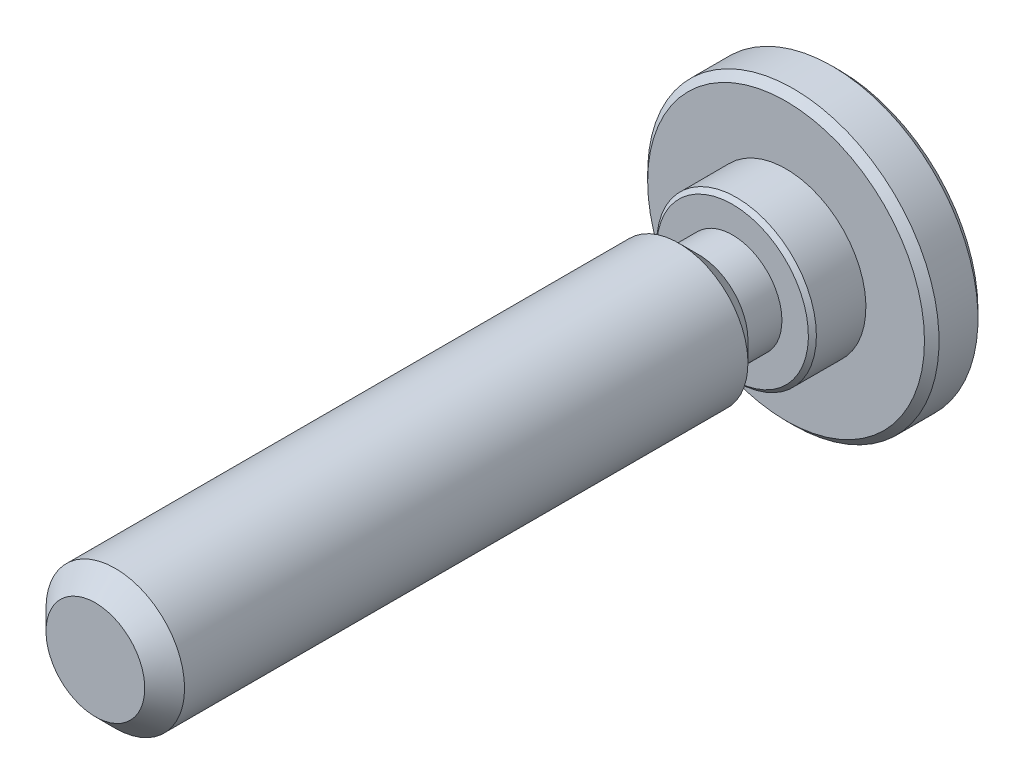
ISO-10303-21;
HEADER;
FILE_DESCRIPTION(('STEP AP214'),'2;1');
FILE_NAME('part.step','',(''),(''),'','','');
FILE_SCHEMA(('AUTOMOTIVE_DESIGN { 1 0 10303 214 1 1 1 1 }'));
ENDSEC;
DATA;
#1=APPLICATION_CONTEXT('core data for automotive mechanical design processes');
#2=APPLICATION_PROTOCOL_DEFINITION('international standard','automotive_design',2000,#1);
#3=PRODUCT_CONTEXT('',#1,'mechanical');
#4=PRODUCT('Part','Part','',(#3));
#5=PRODUCT_RELATED_PRODUCT_CATEGORY('part','',(#4));
#6=PRODUCT_DEFINITION_FORMATION('','',#4);
#7=PRODUCT_DEFINITION_CONTEXT('part definition',#1,'design');
#8=PRODUCT_DEFINITION('design','',#6,#7);
#9=PRODUCT_DEFINITION_SHAPE('','',#8);
#10=(LENGTH_UNIT() NAMED_UNIT(*) SI_UNIT(.MILLI.,.METRE.));
#11=(NAMED_UNIT(*) PLANE_ANGLE_UNIT() SI_UNIT($,.RADIAN.));
#12=(NAMED_UNIT(*) SI_UNIT($,.STERADIAN.) SOLID_ANGLE_UNIT());
#13=UNCERTAINTY_MEASURE_WITH_UNIT(LENGTH_MEASURE(1.E-05),#10,'distance_accuracy_value','');
#14=(GEOMETRIC_REPRESENTATION_CONTEXT(3) GLOBAL_UNCERTAINTY_ASSIGNED_CONTEXT((#13)) GLOBAL_UNIT_ASSIGNED_CONTEXT((#10,
#11,#12)) REPRESENTATION_CONTEXT('',''));
#15=CARTESIAN_POINT('',(0.,0.,0.));
#16=DIRECTION('',(0.,0.,1.));
#17=DIRECTION('',(1.,0.,0.));
#18=AXIS2_PLACEMENT_3D('',#15,#16,#17);
#19=CARTESIAN_POINT('',(0.,0.,-1.6002));
#20=DIRECTION('',(0.,0.,1.));
#21=DIRECTION('',(0.,-1.,0.));
#22=AXIS2_PLACEMENT_3D('',#19,#20,#21);
#23=PLANE('',#22);
#24=CARTESIAN_POINT('',(0.,0.,-1.6002));
#25=DIRECTION('',(0.,0.,1.));
#26=DIRECTION('',(0.,-1.,0.));
#27=AXIS2_PLACEMENT_3D('',#24,#25,#26);
#28=CIRCLE('',#27,4.13829499999999);
#29=CARTESIAN_POINT('',(0.,-4.13829499999999,-1.6002));
#30=VERTEX_POINT('',#29);
#31=EDGE_CURVE('E217',#30,#30,#28,.F.);
#32=ORIENTED_EDGE('',*,*,#31,.T.);
#33=EDGE_LOOP('',(#32));
#34=FACE_BOUND('',#33,.T.);
#35=CARTESIAN_POINT('',(0.,0.,-1.6002));
#36=DIRECTION('',(0.,0.,-1.));
#37=DIRECTION('',(0.,1.,0.));
#38=AXIS2_PLACEMENT_3D('',#35,#36,#37);
#39=CIRCLE('',#38,1.14567944042316);
#40=CARTESIAN_POINT('',(0.,-1.14567944042316,-1.6002));
#41=VERTEX_POINT('',#40);
#42=CARTESIAN_POINT('',(-0.9921875,-0.572839720211582,-1.6002));
#43=VERTEX_POINT('',#42);
#44=EDGE_CURVE('E56',#41,#43,#39,.T.);
#45=ORIENTED_EDGE('',*,*,#44,.F.);
#46=CARTESIAN_POINT('',(0.9921875,-0.572839720211581,-1.6002));
#47=VERTEX_POINT('',#46);
#48=EDGE_CURVE('E132',#47,#41,#39,.T.);
#49=ORIENTED_EDGE('',*,*,#48,.F.);
#50=CARTESIAN_POINT('',(0.9921875,0.572839720211582,-1.6002));
#51=VERTEX_POINT('',#50);
#52=EDGE_CURVE('E127',#51,#47,#39,.T.);
#53=ORIENTED_EDGE('',*,*,#52,.F.);
#54=CARTESIAN_POINT('',(0.,1.14567944042316,-1.6002));
#55=VERTEX_POINT('',#54);
#56=EDGE_CURVE('E97',#55,#51,#39,.T.);
#57=ORIENTED_EDGE('',*,*,#56,.F.);
#58=CARTESIAN_POINT('',(-0.9921875,0.572839720211582,-1.6002));
#59=VERTEX_POINT('',#58);
#60=EDGE_CURVE('E88',#59,#55,#39,.T.);
#61=ORIENTED_EDGE('',*,*,#60,.F.);
#62=EDGE_CURVE('E49',#43,#59,#39,.T.);
#63=ORIENTED_EDGE('',*,*,#62,.F.);
#64=EDGE_LOOP('',(#45,#49,#53,#57,#61,#63));
#65=FACE_BOUND('',#64,.T.);
#66=ADVANCED_FACE('F35',(#34,#65),#23,.F.);
#67=CARTESIAN_POINT('',(0.,0.,20.6502));
#68=DIRECTION('',(0.,0.,1.));
#69=DIRECTION('',(0.,-1.,0.));
#70=AXIS2_PLACEMENT_3D('',#67,#68,#69);
#71=CYLINDRICAL_SURFACE('',#70,4.3561);
#72=CARTESIAN_POINT('',(0.,0.,-1.38239499999999));
#73=DIRECTION('',(0.,0.,1.));
#74=DIRECTION('',(0.,-1.,0.));
#75=AXIS2_PLACEMENT_3D('',#72,#73,#74);
#76=CIRCLE('',#75,4.3561);
#77=CARTESIAN_POINT('',(0.,-4.3561,-1.38239499999999));
#78=VERTEX_POINT('',#77);
#79=EDGE_CURVE('E218',#78,#78,#76,.T.);
#80=ORIENTED_EDGE('',*,*,#79,.T.);
#81=EDGE_LOOP('',(#80));
#82=FACE_BOUND('',#81,.T.);
#83=CARTESIAN_POINT('',(0.,0.,-0.217804999999991));
#84=DIRECTION('',(0.,0.,-1.));
#85=DIRECTION('',(0.,1.,0.));
#86=AXIS2_PLACEMENT_3D('',#83,#84,#85);
#87=CIRCLE('',#86,4.3561);
#88=CARTESIAN_POINT('',(0.,4.3561,-0.217804999999991));
#89=VERTEX_POINT('',#88);
#90=EDGE_CURVE('E213',#89,#89,#87,.T.);
#91=ORIENTED_EDGE('',*,*,#90,.T.);
#92=EDGE_LOOP('',(#91));
#93=FACE_BOUND('',#92,.T.);
#94=ADVANCED_FACE('F183',(#82,#93),#71,.T.);
#95=CARTESIAN_POINT('',(0.,4.3561,0.));
#96=DIRECTION('',(0.,0.,-1.));
#97=DIRECTION('',(0.,1.,0.));
#98=AXIS2_PLACEMENT_3D('',#95,#96,#97);
#99=PLANE('',#98);
#100=CARTESIAN_POINT('',(0.,0.,0.));
#101=DIRECTION('',(0.,0.,-1.));
#102=DIRECTION('',(0.,1.,0.));
#103=AXIS2_PLACEMENT_3D('',#100,#101,#102);
#104=CIRCLE('',#103,4.13829500000001);
#105=CARTESIAN_POINT('',(0.,4.13829500000001,0.));
#106=VERTEX_POINT('',#105);
#107=EDGE_CURVE('E106',#106,#106,#104,.F.);
#108=ORIENTED_EDGE('',*,*,#107,.T.);
#109=EDGE_LOOP('',(#108));
#110=FACE_BOUND('',#109,.T.);
#111=CARTESIAN_POINT('',(0.,0.,0.));
#112=DIRECTION('',(0.,0.,1.));
#113=DIRECTION('',(0.,-1.,0.));
#114=AXIS2_PLACEMENT_3D('',#111,#112,#113);
#115=CIRCLE('',#114,2.3876);
#116=CARTESIAN_POINT('',(0.,-2.3876,0.));
#117=VERTEX_POINT('',#116);
#118=EDGE_CURVE('E230',#117,#117,#115,.T.);
#119=ORIENTED_EDGE('',*,*,#118,.F.);
#120=EDGE_LOOP('',(#119));
#121=FACE_BOUND('',#120,.T.);
#122=ADVANCED_FACE('F191',(#110,#121),#99,.F.);
#123=CARTESIAN_POINT('',(0.,0.,20.6502));
#124=DIRECTION('',(0.,0.,1.));
#125=DIRECTION('',(0.,-1.,0.));
#126=AXIS2_PLACEMENT_3D('',#123,#124,#125);
#127=CYLINDRICAL_SURFACE('',#126,2.3876);
#128=CARTESIAN_POINT('',(0.,0.,1.48082));
#129=DIRECTION('',(0.,0.,-1.));
#130=DIRECTION('',(0.,1.,0.));
#131=AXIS2_PLACEMENT_3D('',#128,#129,#130);
#132=CIRCLE('',#131,2.3876);
#133=CARTESIAN_POINT('',(0.,2.3876,1.48082));
#134=VERTEX_POINT('',#133);
#135=EDGE_CURVE('E11',#134,#134,#132,.T.);
#136=ORIENTED_EDGE('',*,*,#135,.T.);
#137=EDGE_LOOP('',(#136));
#138=FACE_BOUND('',#137,.T.);
#139=ORIENTED_EDGE('',*,*,#118,.T.);
#140=EDGE_LOOP('',(#139));
#141=FACE_BOUND('',#140,.T.);
#142=ADVANCED_FACE('F334',(#138,#141),#127,.T.);
#143=CARTESIAN_POINT('',(0.,2.3876,1.6002));
#144=DIRECTION('',(0.,0.,-1.));
#145=DIRECTION('',(0.,1.,0.));
#146=AXIS2_PLACEMENT_3D('',#143,#144,#145);
#147=PLANE('',#146);
#148=CARTESIAN_POINT('',(0.,0.,1.6002));
#149=DIRECTION('',(0.,0.,-1.));
#150=DIRECTION('',(0.,1.,0.));
#151=AXIS2_PLACEMENT_3D('',#148,#149,#150);
#152=CIRCLE('',#151,2.26822000000001);
#153=CARTESIAN_POINT('',(0.,2.26822000000001,1.6002));
#154=VERTEX_POINT('',#153);
#155=EDGE_CURVE('E43',#154,#154,#152,.F.);
#156=ORIENTED_EDGE('',*,*,#155,.T.);
#157=EDGE_LOOP('',(#156));
#158=FACE_BOUND('',#157,.T.);
#159=CARTESIAN_POINT('',(0.,0.,1.6002));
#160=DIRECTION('',(0.,0.,1.));
#161=DIRECTION('',(0.,-1.,0.));
#162=AXIS2_PLACEMENT_3D('',#159,#160,#161);
#163=CIRCLE('',#162,1.4760575);
#164=CARTESIAN_POINT('',(0.,-1.4760575,1.6002));
#165=VERTEX_POINT('',#164);
#166=EDGE_CURVE('E233',#165,#165,#163,.T.);
#167=ORIENTED_EDGE('',*,*,#166,.F.);
#168=EDGE_LOOP('',(#167));
#169=FACE_BOUND('',#168,.T.);
#170=ADVANCED_FACE('F171',(#158,#169),#147,.F.);
#171=CARTESIAN_POINT('',(0.,0.,20.6502));
#172=DIRECTION('',(0.,0.,1.));
#173=DIRECTION('',(0.,-1.,0.));
#174=AXIS2_PLACEMENT_3D('',#171,#172,#173);
#175=CYLINDRICAL_SURFACE('',#174,1.4760575);
#176=CARTESIAN_POINT('',(0.,0.,2.6162));
#177=DIRECTION('',(0.,0.,1.));
#178=DIRECTION('',(0.,-1.,0.));
#179=AXIS2_PLACEMENT_3D('',#176,#177,#178);
#180=CIRCLE('',#179,1.4760575);
#181=CARTESIAN_POINT('',(0.,-1.4760575,2.6162));
#182=VERTEX_POINT('',#181);
#183=EDGE_CURVE('E236',#182,#182,#180,.T.);
#184=ORIENTED_EDGE('',*,*,#183,.F.);
#185=EDGE_LOOP('',(#184));
#186=FACE_BOUND('',#185,.T.);
#187=ORIENTED_EDGE('',*,*,#166,.T.);
#188=EDGE_LOOP('',(#187));
#189=FACE_BOUND('',#188,.T.);
#190=ADVANCED_FACE('F371',(#186,#189),#175,.T.);
#191=CARTESIAN_POINT('',(0.,0.,2.6162));
#192=DIRECTION('',(0.,0.,1.));
#193=DIRECTION('',(0.,-1.,0.));
#194=AXIS2_PLACEMENT_3D('',#191,#192,#193);
#195=CONICAL_SURFACE('',#194,1.4760575,0.785398163397447);
#196=CARTESIAN_POINT('',(0.,0.,3.2115125));
#197=DIRECTION('',(0.,0.,1.));
#198=DIRECTION('',(0.,-1.,0.));
#199=AXIS2_PLACEMENT_3D('',#196,#197,#198);
#200=CIRCLE('',#199,2.07137);
#201=CARTESIAN_POINT('',(0.,-2.07137,3.2115125));
#202=VERTEX_POINT('',#201);
#203=EDGE_CURVE('E239',#202,#202,#200,.T.);
#204=ORIENTED_EDGE('',*,*,#203,.F.);
#205=EDGE_LOOP('',(#204));
#206=FACE_BOUND('',#205,.T.);
#207=ORIENTED_EDGE('',*,*,#183,.T.);
#208=EDGE_LOOP('',(#207));
#209=FACE_BOUND('',#208,.T.);
#210=ADVANCED_FACE('F378',(#206,#209),#195,.T.);
#211=CARTESIAN_POINT('',(0.,0.,20.6502));
#212=DIRECTION('',(0.,0.,1.));
#213=DIRECTION('',(0.,-1.,0.));
#214=AXIS2_PLACEMENT_3D('',#211,#212,#213);
#215=CYLINDRICAL_SURFACE('',#214,2.07137);
#216=CARTESIAN_POINT('',(0.,0.,20.0548875));
#217=DIRECTION('',(0.,0.,-1.));
#218=DIRECTION('',(0.,1.,0.));
#219=AXIS2_PLACEMENT_3D('',#216,#217,#218);
#220=CIRCLE('',#219,2.07137);
#221=CARTESIAN_POINT('',(0.,2.07137,20.0548875));
#222=VERTEX_POINT('',#221);
#223=EDGE_CURVE('E224',#222,#222,#220,.T.);
#224=ORIENTED_EDGE('',*,*,#223,.T.);
#225=EDGE_LOOP('',(#224));
#226=FACE_BOUND('',#225,.T.);
#227=ORIENTED_EDGE('',*,*,#203,.T.);
#228=EDGE_LOOP('',(#227));
#229=FACE_BOUND('',#228,.T.);
#230=ADVANCED_FACE('F386',(#226,#229),#215,.T.);
#231=CARTESIAN_POINT('',(0.,2.07137,20.6502));
#232=DIRECTION('',(0.,0.,-1.));
#233=DIRECTION('',(0.,1.,0.));
#234=AXIS2_PLACEMENT_3D('',#231,#232,#233);
#235=PLANE('',#234);
#236=CARTESIAN_POINT('',(0.,0.,20.6502));
#237=DIRECTION('',(0.,0.,-1.));
#238=DIRECTION('',(0.,1.,0.));
#239=AXIS2_PLACEMENT_3D('',#236,#237,#238);
#240=CIRCLE('',#239,1.4760575);
#241=CARTESIAN_POINT('',(0.,1.47605749999999,20.6502));
#242=VERTEX_POINT('',#241);
#243=EDGE_CURVE('E227',#242,#242,#240,.F.);
#244=ORIENTED_EDGE('',*,*,#243,.T.);
#245=EDGE_LOOP('',(#244));
#246=FACE_BOUND('',#245,.T.);
#247=ADVANCED_FACE('F201',(#246),#235,.F.);
#248=CARTESIAN_POINT('',(0.,0.,20.6502));
#249=DIRECTION('',(0.,0.,-1.));
#250=DIRECTION('',(0.,1.,0.));
#251=AXIS2_PLACEMENT_3D('',#248,#249,#250);
#252=CONICAL_SURFACE('',#251,1.4760575,0.785398163397448);
#253=ORIENTED_EDGE('',*,*,#223,.F.);
#254=EDGE_LOOP('',(#253));
#255=FACE_BOUND('',#254,.T.);
#256=ORIENTED_EDGE('',*,*,#243,.F.);
#257=EDGE_LOOP('',(#256));
#258=FACE_BOUND('',#257,.T.);
#259=ADVANCED_FACE('F197',(#255,#258),#252,.T.);
#260=CARTESIAN_POINT('',(0.,0.,-1.38239499999999));
#261=DIRECTION('',(0.,0.,1.));
#262=DIRECTION('',(0.,-1.,0.));
#263=AXIS2_PLACEMENT_3D('',#260,#261,#262);
#264=CONICAL_SURFACE('',#263,4.3561,0.785398163397448);
#265=ORIENTED_EDGE('',*,*,#31,.F.);
#266=EDGE_LOOP('',(#265));
#267=FACE_BOUND('',#266,.T.);
#268=ORIENTED_EDGE('',*,*,#79,.F.);
#269=EDGE_LOOP('',(#268));
#270=FACE_BOUND('',#269,.T.);
#271=ADVANCED_FACE('F200',(#267,#270),#264,.T.);
#272=CARTESIAN_POINT('',(0.,0.,0.));
#273=DIRECTION('',(0.,0.,-1.));
#274=DIRECTION('',(0.,1.,0.));
#275=AXIS2_PLACEMENT_3D('',#272,#273,#274);
#276=CONICAL_SURFACE('',#275,4.13829500000001,0.785398163397446);
#277=ORIENTED_EDGE('',*,*,#90,.F.);
#278=EDGE_LOOP('',(#277));
#279=FACE_BOUND('',#278,.T.);
#280=ORIENTED_EDGE('',*,*,#107,.F.);
#281=EDGE_LOOP('',(#280));
#282=FACE_BOUND('',#281,.T.);
#283=ADVANCED_FACE('F204',(#279,#282),#276,.T.);
#284=CARTESIAN_POINT('',(0.,0.,-1.6002));
#285=DIRECTION('',(0.,0.,-1.));
#286=DIRECTION('',(0.,1.,0.));
#287=AXIS2_PLACEMENT_3D('',#284,#285,#286);
#288=CONICAL_SURFACE('',#287,1.14567944042316,0.78539816339745);
#289=ORIENTED_EDGE('',*,*,#56,.T.);
#290=CARTESIAN_POINT('',(-0.000199999999999341,1.145794910477,-1.60031548750897));
#291=CARTESIAN_POINT('',(0.0339140752321566,1.12609913995856,-1.58063281140465));
#292=CARTESIAN_POINT('',(0.0685985894922803,1.10607402631377,-1.56210568451841));
#293=CARTESIAN_POINT('',(0.13932458119996,1.06524035596264,-1.5281823296504));
#294=CARTESIAN_POINT('',(0.175372791624243,1.04442791197037,-1.51280498723095));
#295=CARTESIAN_POINT('',(0.248062511737396,1.00246048249572,-1.48646314273428));
#296=CARTESIAN_POINT('',(0.284685489013202,0.981316196707011,-1.47543239651314));
#297=CARTESIAN_POINT('',(0.358737506246057,0.938562244623588,-1.45843620567294));
#298=CARTESIAN_POINT('',(0.396164282559343,0.916953885244212,-1.45245806757892));
#299=CARTESIAN_POINT('',(0.460664638605471,0.879714587318153,-1.44706634491429));
#300=CARTESIAN_POINT('',(0.48765429931453,0.864132099442442,-1.44626899638834));
#301=CARTESIAN_POINT('',(0.541581355945665,0.832997298779852,-1.44760819336142));
#302=CARTESIAN_POINT('',(0.56851873902424,0.817444993408172,-1.44974538613705));
#303=CARTESIAN_POINT('',(0.648946222958498,0.771010163908484,-1.46041757130602));
#304=CARTESIAN_POINT('',(0.702036069363283,0.740358726795445,-1.47321438072271));
#305=CARTESIAN_POINT('',(0.795214637965797,0.68656205513008,-1.50409746765013));
#306=CARTESIAN_POINT('',(0.835740306309516,0.663164549602744,-1.5205650089077));
#307=CARTESIAN_POINT('',(0.915204315708207,0.617285982385523,-1.55766038355681));
#308=CARTESIAN_POINT('',(0.954147338261523,0.594802217831308,-1.57827468064554));
#309=CARTESIAN_POINT('',(0.9923875,0.572724250157744,-1.60031548750897));
#310=B_SPLINE_CURVE_WITH_KNOTS('',3,(#290,#291,#292,#293,#294,#295,#296,#297,#298,#299,#300,
#301,#302,#303,#304,#305,#306,#307,#308,#309),.UNSPECIFIED.,.F.,.F.,(4,2,2,2,2,2,2,2,2,4),(0.,
0.13219718521019,0.265165186853263,0.396020097605669,0.526545281028574,0.619935205043264,
0.713345731536164,0.900220051846369,1.04884529769095,1.19699303557669),.UNSPECIFIED.);
#311=EDGE_CURVE('E101',#55,#51,#310,.T.);
#312=ORIENTED_EDGE('',*,*,#311,.F.);
#313=EDGE_LOOP('',(#289,#312));
#314=FACE_BOUND('',#313,.T.);
#315=ADVANCED_FACE('F102',(#314),#288,.F.);
#316=ORIENTED_EDGE('',*,*,#52,.T.);
#317=CARTESIAN_POINT('',(0.9921875,-1.14247621078911,-1.96769203940828));
#318=CARTESIAN_POINT('',(0.9921875,-1.11465764801141,-1.9466916392497));
#319=CARTESIAN_POINT('',(0.9921875,-1.08668408094051,-1.92589714770578));
#320=CARTESIAN_POINT('',(0.9921875,-1.03036405365905,-1.8848050376869));
#321=CARTESIAN_POINT('',(0.9921875,-1.00201750223733,-1.86450754435707));
#322=CARTESIAN_POINT('',(0.9921875,-0.915909012346496,-1.80419850749393));
#323=CARTESIAN_POINT('',(0.9921875,-0.857501195839067,-1.76509385217264));
#324=CARTESIAN_POINT('',(0.9921875,-0.735022281240404,-1.68832675276114));
#325=CARTESIAN_POINT('',(0.9921875,-0.670818221894543,-1.65087403099626));
#326=CARTESIAN_POINT('',(0.9921875,-0.539203244212803,-1.58236502046105));
#327=CARTESIAN_POINT('',(0.9921875,-0.471804118965062,-1.55128716825431));
#328=CARTESIAN_POINT('',(0.9921875,-0.370637445252798,-1.51326629623626));
#329=CARTESIAN_POINT('',(0.9921875,-0.338367677251604,-1.50235403233245));
#330=CARTESIAN_POINT('',(0.9921875,-0.273049086247197,-1.48312023009933));
#331=CARTESIAN_POINT('',(0.9921875,-0.240000209742886,-1.47479887024719));
#332=CARTESIAN_POINT('',(0.9921875,-0.173878395816094,-1.46131877368215));
#333=CARTESIAN_POINT('',(0.9921875,-0.14081677471647,-1.45610539396509));
#334=CARTESIAN_POINT('',(0.9921875,-0.0743291671992143,-1.44893971245706));
#335=CARTESIAN_POINT('',(0.9921875,-0.0409031259919574,-1.44698790803542));
#336=CARTESIAN_POINT('',(0.9921875,0.0247631141129255,-1.44649348590571));
#337=CARTESIAN_POINT('',(0.9921875,0.0570024445003671,-1.44783003142075));
#338=CARTESIAN_POINT('',(0.9921875,0.121194220501071,-1.45357104321383));
#339=CARTESIAN_POINT('',(0.9921875,0.153146730366263,-1.45797480409387));
#340=CARTESIAN_POINT('',(0.9921875,0.217090524657736,-1.46968451115969));
#341=CARTESIAN_POINT('',(0.9921875,0.249072542149665,-1.47704030243664));
#342=CARTESIAN_POINT('',(0.9921875,0.312337779758396,-1.4942630913854));
#343=CARTESIAN_POINT('',(0.9921875,0.343621058108106,-1.50412987893501));
#344=CARTESIAN_POINT('',(0.9921875,0.442112983138563,-1.53890611159688));
#345=CARTESIAN_POINT('',(0.9921875,0.50791977119888,-1.56777616415081));
#346=CARTESIAN_POINT('',(0.9921875,0.636441891183645,-1.63196520992333));
#347=CARTESIAN_POINT('',(0.9921875,0.699145053961294,-1.66730737220965));
#348=CARTESIAN_POINT('',(0.9921875,0.818979830095494,-1.74022137086766));
#349=CARTESIAN_POINT('',(0.9921875,0.876233471712468,-1.77759513504847));
#350=CARTESIAN_POINT('',(0.9921875,0.960585190784998,-1.83537111190454));
#351=CARTESIAN_POINT('',(0.9921875,0.988338378424189,-1.85483348767096));
#352=CARTESIAN_POINT('',(0.9921875,1.04346551341387,-1.89427298177173));
#353=CARTESIAN_POINT('',(0.9921875,1.07083956239906,-1.91424995788478));
#354=CARTESIAN_POINT('',(0.9921875,1.09805574523311,-1.93444030564271));
#355=B_SPLINE_CURVE_WITH_KNOTS('',3,(#317,#318,#319,#320,#321,#322,#323,#324,#325,#326,#327,
#328,#329,#330,#331,#332,#333,#334,#335,#336,#337,#338,#339,#340,#341,#342,#343,#344,#345,#346,
#347,#348,#349,#350,#351,#352,#353,#354),.UNSPECIFIED.,.F.,.F.,(4,2,2,2,2,2,2,2,2,2,2,2,2,2,2,2,
2,2,4),(0.,0.104563127371702,0.209152318679108,0.419927098975114,0.642732653870156,
0.864771652131277,0.966879847039379,1.06899507422301,1.16925752982867,1.26953527342202,
1.36618351686957,1.46280954049584,1.56114078094885,1.65946379566813,1.87441437168727,
2.09015003608822,2.29516517576016,2.39685303378669,2.49851308339968),.UNSPECIFIED.);
#356=EDGE_CURVE('E128',#51,#47,#355,.F.);
#357=ORIENTED_EDGE('',*,*,#356,.F.);
#358=EDGE_LOOP('',(#316,#357));
#359=FACE_BOUND('',#358,.T.);
#360=ADVANCED_FACE('F209',(#359),#288,.F.);
#361=ORIENTED_EDGE('',*,*,#48,.T.);
#362=CARTESIAN_POINT('',(0.9923875,-0.572724250157744,-1.60031548750897));
#363=CARTESIAN_POINT('',(0.958273424767844,-0.592420020676185,-1.58063281140465));
#364=CARTESIAN_POINT('',(0.92358891050772,-0.612445134320978,-1.56210568451841));
#365=CARTESIAN_POINT('',(0.85286291880004,-0.653278804672111,-1.52818232965041));
#366=CARTESIAN_POINT('',(0.816814708375757,-0.674091248664375,-1.51280498723095));
#367=CARTESIAN_POINT('',(0.744124988262603,-0.716058678139022,-1.48646314273428));
#368=CARTESIAN_POINT('',(0.707502010986798,-0.737202963927734,-1.47543239651314));
#369=CARTESIAN_POINT('',(0.633449993753943,-0.779956916011158,-1.45843620567294));
#370=CARTESIAN_POINT('',(0.596023217440656,-0.801565275390534,-1.45245806757892));
#371=CARTESIAN_POINT('',(0.531522861394528,-0.838804573316592,-1.44706634491429));
#372=CARTESIAN_POINT('',(0.504533200685469,-0.854387061192304,-1.44626899638834));
#373=CARTESIAN_POINT('',(0.450606144054335,-0.885521861854894,-1.44760819336142));
#374=CARTESIAN_POINT('',(0.423668760975759,-0.901074167226573,-1.44974538613705));
#375=CARTESIAN_POINT('',(0.343241277041501,-0.947508996726261,-1.46041757130602));
#376=CARTESIAN_POINT('',(0.290151430636716,-0.9781604338393,-1.47321438072271));
#377=CARTESIAN_POINT('',(0.196972862034201,-1.03195710550467,-1.50409746765013));
#378=CARTESIAN_POINT('',(0.156447193690482,-1.055354611032,-1.5205650089077));
#379=CARTESIAN_POINT('',(0.0769831842917919,-1.10123317824922,-1.55766038355681));
#380=CARTESIAN_POINT('',(0.0380401617384758,-1.12371694280344,-1.57827468064554));
#381=CARTESIAN_POINT('',(-0.000200000000000629,-1.145794910477,-1.60031548750897));
#382=B_SPLINE_CURVE_WITH_KNOTS('',3,(#362,#363,#364,#365,#366,#367,#368,#369,#370,#371,#372,
#373,#374,#375,#376,#377,#378,#379,#380,#381),.UNSPECIFIED.,.F.,.F.,(4,2,2,2,2,2,2,2,2,4),(0.,
0.132197185210191,0.265165186853263,0.396020097605671,0.526545281028575,0.619935205043266,
0.713345731536165,0.90022005184637,1.04884529769095,1.1969930355767),.UNSPECIFIED.);
#383=EDGE_CURVE('E130',#47,#41,#382,.T.);
#384=ORIENTED_EDGE('',*,*,#383,.F.);
#385=EDGE_LOOP('',(#361,#384));
#386=FACE_BOUND('',#385,.T.);
#387=ADVANCED_FACE('F298',(#386),#288,.F.);
#388=ORIENTED_EDGE('',*,*,#44,.T.);
#389=CARTESIAN_POINT('',(0.000199999999999375,-1.145794910477,-1.60031548750897));
#390=CARTESIAN_POINT('',(-0.0339140752321566,-1.12609913995856,-1.58063281140465));
#391=CARTESIAN_POINT('',(-0.0685985894922804,-1.10607402631377,-1.56210568451841));
#392=CARTESIAN_POINT('',(-0.13932458119996,-1.06524035596263,-1.5281823296504));
#393=CARTESIAN_POINT('',(-0.175372791624243,-1.04442791197037,-1.51280498723095));
#394=CARTESIAN_POINT('',(-0.248062511737397,-1.00246048249572,-1.48646314273428));
#395=CARTESIAN_POINT('',(-0.284685489013202,-0.981316196707011,-1.47543239651314));
#396=CARTESIAN_POINT('',(-0.358737506246057,-0.938562244623587,-1.45843620567294));
#397=CARTESIAN_POINT('',(-0.396164282559343,-0.916953885244212,-1.45245806757892));
#398=CARTESIAN_POINT('',(-0.460664638605471,-0.879714587318153,-1.44706634491429));
#399=CARTESIAN_POINT('',(-0.48765429931453,-0.864132099442441,-1.44626899638834));
#400=CARTESIAN_POINT('',(-0.541581355945664,-0.832997298779852,-1.44760819336142));
#401=CARTESIAN_POINT('',(-0.56851873902424,-0.817444993408172,-1.44974538613705));
#402=CARTESIAN_POINT('',(-0.648946222958498,-0.771010163908484,-1.46041757130602));
#403=CARTESIAN_POINT('',(-0.702036069363283,-0.740358726795445,-1.47321438072271));
#404=CARTESIAN_POINT('',(-0.795214637965798,-0.686562055130079,-1.50409746765013));
#405=CARTESIAN_POINT('',(-0.835740306309517,-0.663164549602744,-1.5205650089077));
#406=CARTESIAN_POINT('',(-0.915204315708208,-0.617285982385522,-1.55766038355681));
#407=CARTESIAN_POINT('',(-0.954147338261524,-0.594802217831308,-1.57827468064554));
#408=CARTESIAN_POINT('',(-0.9923875,-0.572724250157743,-1.60031548750897));
#409=B_SPLINE_CURVE_WITH_KNOTS('',3,(#389,#390,#391,#392,#393,#394,#395,#396,#397,#398,#399,
#400,#401,#402,#403,#404,#405,#406,#407,#408),.UNSPECIFIED.,.F.,.F.,(4,2,2,2,2,2,2,2,2,4),(0.,
0.13219718521019,0.265165186853263,0.39602009760567,0.526545281028574,0.619935205043264,
0.713345731536164,0.900220051846369,1.04884529769095,1.1969930355767),.UNSPECIFIED.);
#410=EDGE_CURVE('E274',#41,#43,#409,.T.);
#411=ORIENTED_EDGE('',*,*,#410,.F.);
#412=EDGE_LOOP('',(#388,#411));
#413=FACE_BOUND('',#412,.T.);
#414=ADVANCED_FACE('F297',(#413),#288,.F.);
#415=ORIENTED_EDGE('',*,*,#62,.T.);
#416=CARTESIAN_POINT('',(-0.9921875,-1.14247621095533,-1.96769203953379));
#417=CARTESIAN_POINT('',(-0.9921875,-1.11465764817297,-1.94669163937037));
#418=CARTESIAN_POINT('',(-0.9921875,-1.08668408109739,-1.92589714782163));
#419=CARTESIAN_POINT('',(-0.9921875,-1.03036405380652,-1.88480503779312));
#420=CARTESIAN_POINT('',(-0.9921875,-1.00201750238008,-1.86450754445849));
#421=CARTESIAN_POINT('',(-0.9921875,-0.915909012474784,-1.80419850758086));
#422=CARTESIAN_POINT('',(-0.9921875,-0.857501195957518,-1.76509385224995));
#423=CARTESIAN_POINT('',(-0.9921875,-0.735022281337405,-1.68832675281867));
#424=CARTESIAN_POINT('',(-0.9921875,-0.670818221979872,-1.6508740310437));
#425=CARTESIAN_POINT('',(-0.9921875,-0.539203244273795,-1.58236502048978));
#426=CARTESIAN_POINT('',(-0.9921875,-0.471804119013397,-1.55128716827442));
#427=CARTESIAN_POINT('',(-0.9921875,-0.370637445291611,-1.51326629624996));
#428=CARTESIAN_POINT('',(-0.9921875,-0.338367677294404,-1.5023540323464));
#429=CARTESIAN_POINT('',(-0.9921875,-0.273049086298104,-1.48312023011298));
#430=CARTESIAN_POINT('',(-0.9921875,-0.240000209797912,-1.47479887026028));
#431=CARTESIAN_POINT('',(-0.9921875,-0.173878395879219,-1.46131877369319));
#432=CARTESIAN_POINT('',(-0.9921875,-0.140816774783574,-1.45610539397466));
#433=CARTESIAN_POINT('',(-0.9921875,-0.0743291672741458,-1.44893971246279));
#434=CARTESIAN_POINT('',(-0.9921875,-0.0409031260707375,-1.4469879080388));
#435=CARTESIAN_POINT('',(-0.9921875,0.0247631140270456,-1.44649348590368));
#436=CARTESIAN_POINT('',(-0.9921875,0.057002444411226,-1.44783003141573));
#437=CARTESIAN_POINT('',(-0.9921875,0.121194220405734,-1.45357104320236));
#438=CARTESIAN_POINT('',(-0.9921875,0.153146730267991,-1.45797480407893));
#439=CARTESIAN_POINT('',(-0.9921875,0.217090524553671,-1.46968451113751));
#440=CARTESIAN_POINT('',(-0.9921875,0.249072542042749,-1.47704030241065));
#441=CARTESIAN_POINT('',(-0.9921875,0.312337779646056,-1.49426309135171));
#442=CARTESIAN_POINT('',(-0.9921875,0.34362105799319,-1.50412987889742));
#443=CARTESIAN_POINT('',(-0.9921875,0.442112982998624,-1.53890611154092));
#444=CARTESIAN_POINT('',(-0.9921875,0.507919771037748,-1.56777616407796));
#445=CARTESIAN_POINT('',(-0.9921875,0.636441890981752,-1.63196520981482));
#446=CARTESIAN_POINT('',(-0.9921875,0.699145053739845,-1.66730737208238));
#447=CARTESIAN_POINT('',(-0.9921875,0.818979829838885,-1.74022137070446));
#448=CARTESIAN_POINT('',(-0.9921875,0.87623347144013,-1.77759513486827));
#449=CARTESIAN_POINT('',(-0.9921875,0.960585190489403,-1.83537111169895));
#450=CARTESIAN_POINT('',(-0.9921875,0.988338378120953,-1.85483348745697));
#451=CARTESIAN_POINT('',(-0.9921875,1.0434655130954,-1.89427298154095));
#452=CARTESIAN_POINT('',(-0.9921875,1.070839562073,-1.91424995764561));
#453=CARTESIAN_POINT('',(-0.9921875,1.09805574489947,-1.93444030539516));
#454=B_SPLINE_CURVE_WITH_KNOTS('',3,(#416,#417,#418,#419,#420,#421,#422,#423,#424,#425,#426,
#427,#428,#429,#430,#431,#432,#433,#434,#435,#436,#437,#438,#439,#440,#441,#442,#443,#444,#445,
#446,#447,#448,#449,#450,#451,#452,#453),.UNSPECIFIED.,.F.,.F.,(4,2,2,2,2,2,2,2,2,2,2,2,2,2,2,2,
2,2,4),(0.,0.104563127391605,0.209152318718919,0.419927099055485,0.642732653996012,
0.864771652302186,0.966879847198756,1.06899507437088,1.1692575299655,1.2695352735478,
1.36618351698525,1.4628095406014,1.56114078104352,1.65946379575192,1.87441437169281,
2.090150036015,2.29516517561956,2.39685303361285,2.4985130831926),.UNSPECIFIED.);
#455=EDGE_CURVE('E116',#43,#59,#454,.T.);
#456=ORIENTED_EDGE('',*,*,#455,.F.);
#457=EDGE_LOOP('',(#415,#456));
#458=FACE_BOUND('',#457,.T.);
#459=ADVANCED_FACE('F304',(#458),#288,.F.);
#460=ORIENTED_EDGE('',*,*,#60,.T.);
#461=CARTESIAN_POINT('',(-0.9923875,0.572724250157745,-1.60031548750897));
#462=CARTESIAN_POINT('',(-0.958273424767844,0.592420020676185,-1.58063281140465));
#463=CARTESIAN_POINT('',(-0.92358891050772,0.612445134320979,-1.56210568451841));
#464=CARTESIAN_POINT('',(-0.85286291880004,0.653278804672111,-1.5281823296504));
#465=CARTESIAN_POINT('',(-0.816814708375757,0.674091248664375,-1.51280498723095));
#466=CARTESIAN_POINT('',(-0.744124988262604,0.716058678139023,-1.48646314273428));
#467=CARTESIAN_POINT('',(-0.707502010986798,0.737202963927735,-1.47543239651314));
#468=CARTESIAN_POINT('',(-0.633449993753943,0.779956916011158,-1.45843620567294));
#469=CARTESIAN_POINT('',(-0.596023217440656,0.801565275390534,-1.45245806757892));
#470=CARTESIAN_POINT('',(-0.531522861394528,0.838804573316593,-1.44706634491429));
#471=CARTESIAN_POINT('',(-0.504533200685469,0.854387061192304,-1.44626899638834));
#472=CARTESIAN_POINT('',(-0.450606144054335,0.885521861854894,-1.44760819336142));
#473=CARTESIAN_POINT('',(-0.423668760975759,0.901074167226574,-1.44974538613705));
#474=CARTESIAN_POINT('',(-0.343241277041501,0.947508996726262,-1.46041757130602));
#475=CARTESIAN_POINT('',(-0.290151430636716,0.978160433839301,-1.47321438072271));
#476=CARTESIAN_POINT('',(-0.196972862034201,1.03195710550467,-1.50409746765013));
#477=CARTESIAN_POINT('',(-0.156447193690482,1.055354611032,-1.5205650089077));
#478=CARTESIAN_POINT('',(-0.0769831842917918,1.10123317824922,-1.55766038355681));
#479=CARTESIAN_POINT('',(-0.0380401617384757,1.12371694280344,-1.57827468064554));
#480=CARTESIAN_POINT('',(0.00020000000000077,1.145794910477,-1.60031548750897));
#481=B_SPLINE_CURVE_WITH_KNOTS('',3,(#461,#462,#463,#464,#465,#466,#467,#468,#469,#470,#471,
#472,#473,#474,#475,#476,#477,#478,#479,#480),.UNSPECIFIED.,.F.,.F.,(4,2,2,2,2,2,2,2,2,4),(0.,
0.13219718521019,0.265165186853263,0.39602009760567,0.526545281028575,0.619935205043265,
0.713345731536165,0.90022005184637,1.04884529769095,1.1969930355767),.UNSPECIFIED.);
#482=EDGE_CURVE('E92',#59,#55,#481,.T.);
#483=ORIENTED_EDGE('',*,*,#482,.F.);
#484=EDGE_LOOP('',(#460,#483));
#485=FACE_BOUND('',#484,.T.);
#486=ADVANCED_FACE('F90',(#485),#288,.F.);
#487=CARTESIAN_POINT('',(0.9921875,1.71851916063474,-0.111918749999999));
#488=DIRECTION('',(0.,0.,-1.));
#489=DIRECTION('',(-1.,0.,0.));
#490=AXIS2_PLACEMENT_3D('',#487,#488,#489);
#491=PLANE('',#490);
#492=DIRECTION('',(0.866025403784439,0.499999999999999,0.));
#493=VECTOR('',#492,1.);
#494=CARTESIAN_POINT('',(-0.9921875,0.572839720211582,-0.111918749999999));
#495=LINE('',#494,#493);
#496=CARTESIAN_POINT('',(-0.9921875,0.572839720211582,-0.111918749999999));
#497=VERTEX_POINT('',#496);
#498=CARTESIAN_POINT('',(0.,1.14567944042316,-0.111918749999999));
#499=VERTEX_POINT('',#498);
#500=EDGE_CURVE('E115',#497,#499,#495,.T.);
#501=ORIENTED_EDGE('',*,*,#500,.T.);
#502=DIRECTION('',(0.866025403784438,-0.5,0.));
#503=VECTOR('',#502,1.);
#504=CARTESIAN_POINT('',(0.,1.14567944042316,-0.111918749999999));
#505=LINE('',#504,#503);
#506=CARTESIAN_POINT('',(0.9921875,0.572839720211581,-0.111918749999999));
#507=VERTEX_POINT('',#506);
#508=EDGE_CURVE('E120',#499,#507,#505,.T.);
#509=ORIENTED_EDGE('',*,*,#508,.T.);
#510=DIRECTION('',(0.,-1.,0.));
#511=VECTOR('',#510,1.);
#512=CARTESIAN_POINT('',(0.9921875,0.572839720211581,-0.111918749999999));
#513=LINE('',#512,#511);
#514=CARTESIAN_POINT('',(0.9921875,-0.572839720211582,-0.111918749999999));
#515=VERTEX_POINT('',#514);
#516=EDGE_CURVE('E260',#507,#515,#513,.T.);
#517=ORIENTED_EDGE('',*,*,#516,.T.);
#518=DIRECTION('',(-0.866025403784439,-0.499999999999999,0.));
#519=VECTOR('',#518,1.);
#520=CARTESIAN_POINT('',(0.9921875,-0.572839720211582,-0.111918749999999));
#521=LINE('',#520,#519);
#522=CARTESIAN_POINT('',(0.,-1.14567944042316,-0.111918749999999));
#523=VERTEX_POINT('',#522);
#524=EDGE_CURVE('E257',#515,#523,#521,.T.);
#525=ORIENTED_EDGE('',*,*,#524,.T.);
#526=DIRECTION('',(-0.866025403784438,0.5,0.));
#527=VECTOR('',#526,1.);
#528=CARTESIAN_POINT('',(0.,-1.14567944042316,-0.111918749999999));
#529=LINE('',#528,#527);
#530=CARTESIAN_POINT('',(-0.9921875,-0.572839720211581,-0.111918749999999));
#531=VERTEX_POINT('',#530);
#532=EDGE_CURVE('E254',#523,#531,#529,.T.);
#533=ORIENTED_EDGE('',*,*,#532,.T.);
#534=DIRECTION('',(0.,1.,0.));
#535=VECTOR('',#534,1.);
#536=CARTESIAN_POINT('',(-0.9921875,-0.572839720211581,-0.111918749999999));
#537=LINE('',#536,#535);
#538=EDGE_CURVE('E123',#531,#497,#537,.T.);
#539=ORIENTED_EDGE('',*,*,#538,.T.);
#540=EDGE_LOOP('',(#501,#509,#517,#525,#533,#539));
#541=FACE_BOUND('',#540,.T.);
#542=ADVANCED_FACE('F159',(#541),#491,.T.);
#543=CARTESIAN_POINT('',(0.,1.14567944042316,-0.111918749999999));
#544=DIRECTION('',(0.5,0.866025403784438,0.));
#545=DIRECTION('',(-0.866025403784438,0.5,0.));
#546=AXIS2_PLACEMENT_3D('',#543,#544,#545);
#547=PLANE('',#546);
#548=DIRECTION('',(0.,0.,-1.));
#549=VECTOR('',#548,1.);
#550=CARTESIAN_POINT('',(0.,1.14567944042316,-0.111918749999999));
#551=LINE('',#550,#549);
#552=EDGE_CURVE('E112',#499,#55,#551,.T.);
#553=ORIENTED_EDGE('',*,*,#552,.T.);
#554=ORIENTED_EDGE('',*,*,#311,.T.);
#555=DIRECTION('',(0.,0.,-1.));
#556=VECTOR('',#555,1.);
#557=CARTESIAN_POINT('',(0.9921875,0.572839720211581,-0.111918749999999));
#558=LINE('',#557,#556);
#559=EDGE_CURVE('E122',#507,#51,#558,.T.);
#560=ORIENTED_EDGE('',*,*,#559,.F.);
#561=ORIENTED_EDGE('',*,*,#508,.F.);
#562=EDGE_LOOP('',(#553,#554,#560,#561));
#563=FACE_BOUND('',#562,.T.);
#564=ADVANCED_FACE('F118',(#563),#547,.F.);
#565=CARTESIAN_POINT('',(0.9921875,0.572839720211581,-0.111918749999999));
#566=DIRECTION('',(1.,0.,0.));
#567=DIRECTION('',(0.,0.,-1.));
#568=AXIS2_PLACEMENT_3D('',#565,#566,#567);
#569=PLANE('',#568);
#570=ORIENTED_EDGE('',*,*,#559,.T.);
#571=ORIENTED_EDGE('',*,*,#356,.T.);
#572=DIRECTION('',(0.,0.,-1.));
#573=VECTOR('',#572,1.);
#574=CARTESIAN_POINT('',(0.9921875,-0.572839720211582,-0.111918749999999));
#575=LINE('',#574,#573);
#576=EDGE_CURVE('E243',#515,#47,#575,.T.);
#577=ORIENTED_EDGE('',*,*,#576,.F.);
#578=ORIENTED_EDGE('',*,*,#516,.F.);
#579=EDGE_LOOP('',(#570,#571,#577,#578));
#580=FACE_BOUND('',#579,.T.);
#581=ADVANCED_FACE('F148',(#580),#569,.F.);
#582=CARTESIAN_POINT('',(0.9921875,-0.572839720211582,-0.111918749999999));
#583=DIRECTION('',(0.499999999999999,-0.866025403784439,0.));
#584=DIRECTION('',(0.866025403784439,0.499999999999999,0.));
#585=AXIS2_PLACEMENT_3D('',#582,#583,#584);
#586=PLANE('',#585);
#587=ORIENTED_EDGE('',*,*,#576,.T.);
#588=ORIENTED_EDGE('',*,*,#383,.T.);
#589=DIRECTION('',(0.,0.,-1.));
#590=VECTOR('',#589,1.);
#591=CARTESIAN_POINT('',(0.,-1.14567944042316,-0.111918749999999));
#592=LINE('',#591,#590);
#593=EDGE_CURVE('E246',#523,#41,#592,.T.);
#594=ORIENTED_EDGE('',*,*,#593,.F.);
#595=ORIENTED_EDGE('',*,*,#524,.F.);
#596=EDGE_LOOP('',(#587,#588,#594,#595));
#597=FACE_BOUND('',#596,.T.);
#598=ADVANCED_FACE('F152',(#597),#586,.F.);
#599=CARTESIAN_POINT('',(0.,-1.14567944042316,-0.111918749999999));
#600=DIRECTION('',(-0.5,-0.866025403784438,0.));
#601=DIRECTION('',(0.866025403784439,-0.5,0.));
#602=AXIS2_PLACEMENT_3D('',#599,#600,#601);
#603=PLANE('',#602);
#604=ORIENTED_EDGE('',*,*,#593,.T.);
#605=ORIENTED_EDGE('',*,*,#410,.T.);
#606=DIRECTION('',(0.,0.,-1.));
#607=VECTOR('',#606,1.);
#608=CARTESIAN_POINT('',(-0.9921875,-0.572839720211581,-0.111918749999999));
#609=LINE('',#608,#607);
#610=EDGE_CURVE('E248',#531,#43,#609,.T.);
#611=ORIENTED_EDGE('',*,*,#610,.F.);
#612=ORIENTED_EDGE('',*,*,#532,.F.);
#613=EDGE_LOOP('',(#604,#605,#611,#612));
#614=FACE_BOUND('',#613,.T.);
#615=ADVANCED_FACE('F281',(#614),#603,.F.);
#616=CARTESIAN_POINT('',(-0.9921875,-0.572839720211581,-0.111918749999999));
#617=DIRECTION('',(-1.,0.,0.));
#618=DIRECTION('',(0.,-1.,0.));
#619=AXIS2_PLACEMENT_3D('',#616,#617,#618);
#620=PLANE('',#619);
#621=ORIENTED_EDGE('',*,*,#610,.T.);
#622=ORIENTED_EDGE('',*,*,#455,.T.);
#623=DIRECTION('',(0.,0.,-1.));
#624=VECTOR('',#623,1.);
#625=CARTESIAN_POINT('',(-0.9921875,0.572839720211582,-0.111918749999999));
#626=LINE('',#625,#624);
#627=EDGE_CURVE('E114',#497,#59,#626,.T.);
#628=ORIENTED_EDGE('',*,*,#627,.F.);
#629=ORIENTED_EDGE('',*,*,#538,.F.);
#630=EDGE_LOOP('',(#621,#622,#628,#629));
#631=FACE_BOUND('',#630,.T.);
#632=ADVANCED_FACE('F180',(#631),#620,.F.);
#633=CARTESIAN_POINT('',(-0.9921875,0.572839720211582,-0.111918749999999));
#634=DIRECTION('',(-0.499999999999999,0.866025403784439,0.));
#635=DIRECTION('',(-0.866025403784439,-0.499999999999999,0.));
#636=AXIS2_PLACEMENT_3D('',#633,#634,#635);
#637=PLANE('',#636);
#638=ORIENTED_EDGE('',*,*,#627,.T.);
#639=ORIENTED_EDGE('',*,*,#482,.T.);
#640=ORIENTED_EDGE('',*,*,#552,.F.);
#641=ORIENTED_EDGE('',*,*,#500,.F.);
#642=EDGE_LOOP('',(#638,#639,#640,#641));
#643=FACE_BOUND('',#642,.T.);
#644=ADVANCED_FACE('F110',(#643),#637,.F.);
#645=CARTESIAN_POINT('',(0.,0.,1.6002));
#646=DIRECTION('',(0.,0.,-1.));
#647=DIRECTION('',(0.,1.,0.));
#648=AXIS2_PLACEMENT_3D('',#645,#646,#647);
#649=CONICAL_SURFACE('',#648,2.26822000000001,0.785398163397436);
#650=ORIENTED_EDGE('',*,*,#135,.F.);
#651=EDGE_LOOP('',(#650));
#652=FACE_BOUND('',#651,.T.);
#653=ORIENTED_EDGE('',*,*,#155,.F.);
#654=EDGE_LOOP('',(#653));
#655=FACE_BOUND('',#654,.T.);
#656=ADVANCED_FACE('F37',(#652,#655),#649,.T.);
#657=CLOSED_SHELL('',(#66,#94,#122,#142,#170,#190,#210,#230,#247,#259,#271,#283,#315,#360,#387,
#414,#459,#486,#542,#564,#581,#598,#615,#632,#644,#656));
#658=MANIFOLD_SOLID_BREP('B2',#657);
#659=ADVANCED_BREP_SHAPE_REPRESENTATION('',(#18,#658),#14);
#660=SHAPE_DEFINITION_REPRESENTATION(#9,#659);
ENDSEC;
END-ISO-10303-21;
